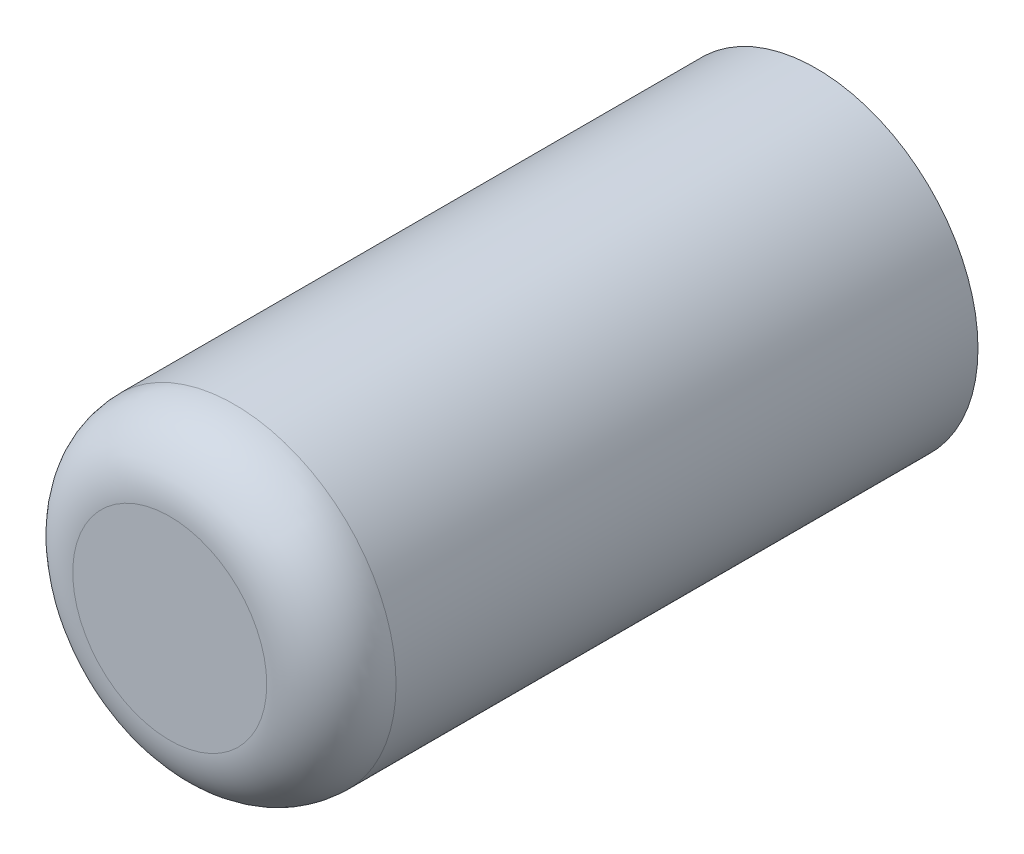
ISO-10303-21;
HEADER;
FILE_DESCRIPTION(('STEP AP214'),'2;1');
FILE_NAME('part.step','',(''),(''),'','','');
FILE_SCHEMA(('AUTOMOTIVE_DESIGN { 1 0 10303 214 1 1 1 1 }'));
ENDSEC;
DATA;
#1=APPLICATION_CONTEXT('core data for automotive mechanical design processes');
#2=APPLICATION_PROTOCOL_DEFINITION('international standard','automotive_design',2000,#1);
#3=PRODUCT_CONTEXT('',#1,'mechanical');
#4=PRODUCT('Part','Part','',(#3));
#5=PRODUCT_RELATED_PRODUCT_CATEGORY('part','',(#4));
#6=PRODUCT_DEFINITION_FORMATION('','',#4);
#7=PRODUCT_DEFINITION_CONTEXT('part definition',#1,'design');
#8=PRODUCT_DEFINITION('design','',#6,#7);
#9=PRODUCT_DEFINITION_SHAPE('','',#8);
#10=(LENGTH_UNIT() NAMED_UNIT(*) SI_UNIT(.MILLI.,.METRE.));
#11=(NAMED_UNIT(*) PLANE_ANGLE_UNIT() SI_UNIT($,.RADIAN.));
#12=(NAMED_UNIT(*) SI_UNIT($,.STERADIAN.) SOLID_ANGLE_UNIT());
#13=UNCERTAINTY_MEASURE_WITH_UNIT(LENGTH_MEASURE(1.E-05),#10,'distance_accuracy_value','');
#14=(GEOMETRIC_REPRESENTATION_CONTEXT(3) GLOBAL_UNCERTAINTY_ASSIGNED_CONTEXT((#13)) GLOBAL_UNIT_ASSIGNED_CONTEXT((#10,
#11,#12)) REPRESENTATION_CONTEXT('',''));
#15=CARTESIAN_POINT('',(0.,0.,0.));
#16=DIRECTION('',(0.,0.,1.));
#17=DIRECTION('',(1.,0.,0.));
#18=AXIS2_PLACEMENT_3D('',#15,#16,#17);
#19=CARTESIAN_POINT('',(0.,0.,100.));
#20=DIRECTION('',(0.,0.,-1.));
#21=DIRECTION('',(-1.,0.,0.));
#22=AXIS2_PLACEMENT_3D('',#19,#20,#21);
#23=CYLINDRICAL_SURFACE('',#22,25.);
#24=CARTESIAN_POINT('',(0.,0.,90.));
#25=DIRECTION('',(0.,0.,1.));
#26=DIRECTION('',(1.,0.,0.));
#27=AXIS2_PLACEMENT_3D('',#24,#25,#26);
#28=CIRCLE('',#27,25.);
#29=CARTESIAN_POINT('',(25.,0.,90.));
#30=VERTEX_POINT('',#29);
#31=EDGE_CURVE('E10',#30,#30,#28,.F.);
#32=ORIENTED_EDGE('',*,*,#31,.T.);
#33=EDGE_LOOP('',(#32));
#34=FACE_BOUND('',#33,.T.);
#35=CARTESIAN_POINT('',(0.,0.,0.));
#36=DIRECTION('',(0.,0.,1.));
#37=DIRECTION('',(1.,0.,0.));
#38=AXIS2_PLACEMENT_3D('',#35,#36,#37);
#39=CIRCLE('',#38,25.);
#40=CARTESIAN_POINT('',(25.,0.,0.));
#41=VERTEX_POINT('',#40);
#42=EDGE_CURVE('E46',#41,#41,#39,.T.);
#43=ORIENTED_EDGE('',*,*,#42,.T.);
#44=EDGE_LOOP('',(#43));
#45=FACE_BOUND('',#44,.T.);
#46=ADVANCED_FACE('F35',(#34,#45),#23,.T.);
#47=CARTESIAN_POINT('',(0.,0.,100.));
#48=DIRECTION('',(0.,0.,1.));
#49=DIRECTION('',(1.,0.,0.));
#50=AXIS2_PLACEMENT_3D('',#47,#48,#49);
#51=PLANE('',#50);
#52=CARTESIAN_POINT('',(0.,0.,100.));
#53=DIRECTION('',(0.,0.,1.));
#54=DIRECTION('',(1.,0.,0.));
#55=AXIS2_PLACEMENT_3D('',#52,#53,#54);
#56=CIRCLE('',#55,15.);
#57=CARTESIAN_POINT('',(15.,0.,100.));
#58=VERTEX_POINT('',#57);
#59=EDGE_CURVE('E42',#58,#58,#56,.T.);
#60=ORIENTED_EDGE('',*,*,#59,.T.);
#61=EDGE_LOOP('',(#60));
#62=FACE_BOUND('',#61,.T.);
#63=ADVANCED_FACE('F56',(#62),#51,.T.);
#64=CARTESIAN_POINT('',(0.,0.,0.));
#65=DIRECTION('',(0.,0.,1.));
#66=DIRECTION('',(1.,0.,0.));
#67=AXIS2_PLACEMENT_3D('',#64,#65,#66);
#68=PLANE('',#67);
#69=ORIENTED_EDGE('',*,*,#42,.F.);
#70=EDGE_LOOP('',(#69));
#71=FACE_BOUND('',#70,.T.);
#72=ADVANCED_FACE('F54',(#71),#68,.F.);
#73=CARTESIAN_POINT('',(0.,0.,90.));
#74=DIRECTION('',(0.,0.,1.));
#75=DIRECTION('',(1.,0.,0.));
#76=AXIS2_PLACEMENT_3D('',#73,#74,#75);
#77=TOROIDAL_SURFACE('',#76,15.,10.);
#78=ORIENTED_EDGE('',*,*,#31,.F.);
#79=EDGE_LOOP('',(#78));
#80=FACE_BOUND('',#79,.T.);
#81=ORIENTED_EDGE('',*,*,#59,.F.);
#82=EDGE_LOOP('',(#81));
#83=FACE_BOUND('',#82,.T.);
#84=ADVANCED_FACE('F37',(#80,#83),#77,.T.);
#85=CLOSED_SHELL('',(#46,#63,#72,#84));
#86=MANIFOLD_SOLID_BREP('B2',#85);
#87=ADVANCED_BREP_SHAPE_REPRESENTATION('',(#18,#86),#14);
#88=SHAPE_DEFINITION_REPRESENTATION(#9,#87);
ENDSEC;
END-ISO-10303-21;
